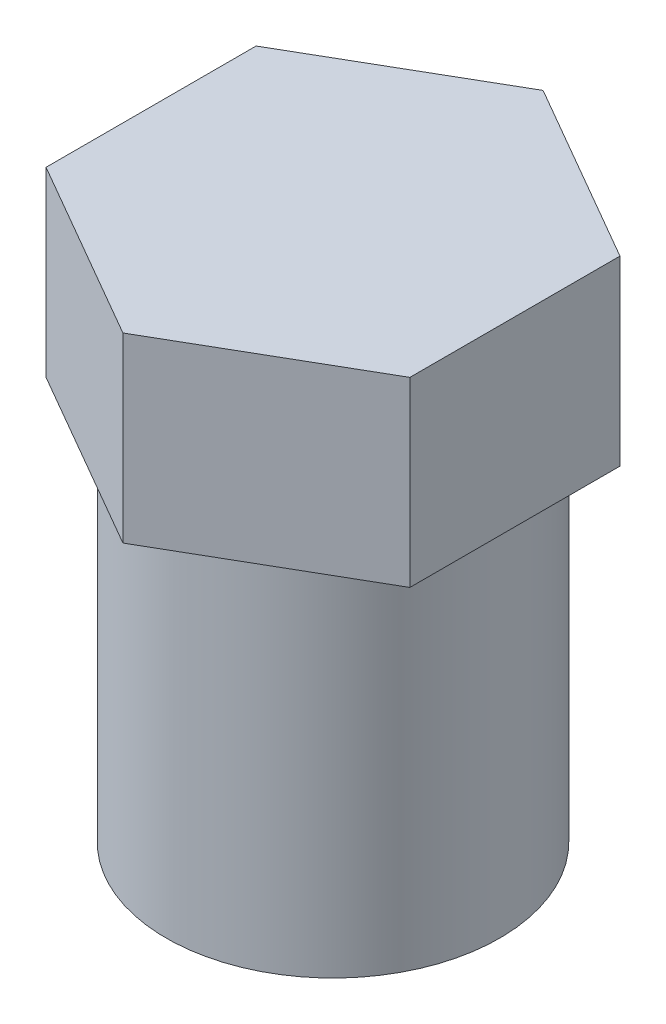
ISO-10303-21;
HEADER;
FILE_DESCRIPTION(('STEP AP214'),'2;1');
FILE_NAME('part.step','',(''),(''),'','','');
FILE_SCHEMA(('AUTOMOTIVE_DESIGN { 1 0 10303 214 1 1 1 1 }'));
ENDSEC;
DATA;
#1=APPLICATION_CONTEXT('core data for automotive mechanical design processes');
#2=APPLICATION_PROTOCOL_DEFINITION('international standard','automotive_design',2000,#1);
#3=PRODUCT_CONTEXT('',#1,'mechanical');
#4=PRODUCT('Part','Part','',(#3));
#5=PRODUCT_RELATED_PRODUCT_CATEGORY('part','',(#4));
#6=PRODUCT_DEFINITION_FORMATION('','',#4);
#7=PRODUCT_DEFINITION_CONTEXT('part definition',#1,'design');
#8=PRODUCT_DEFINITION('design','',#6,#7);
#9=PRODUCT_DEFINITION_SHAPE('','',#8);
#10=(LENGTH_UNIT() NAMED_UNIT(*) SI_UNIT(.MILLI.,.METRE.));
#11=(NAMED_UNIT(*) PLANE_ANGLE_UNIT() SI_UNIT($,.RADIAN.));
#12=(NAMED_UNIT(*) SI_UNIT($,.STERADIAN.) SOLID_ANGLE_UNIT());
#13=UNCERTAINTY_MEASURE_WITH_UNIT(LENGTH_MEASURE(1.E-05),#10,'distance_accuracy_value','');
#14=(GEOMETRIC_REPRESENTATION_CONTEXT(3) GLOBAL_UNCERTAINTY_ASSIGNED_CONTEXT((#13)) GLOBAL_UNIT_ASSIGNED_CONTEXT((#10,
#11,#12)) REPRESENTATION_CONTEXT('',''));
#15=CARTESIAN_POINT('',(0.,0.,0.));
#16=DIRECTION('',(0.,0.,1.));
#17=DIRECTION('',(1.,0.,0.));
#18=AXIS2_PLACEMENT_3D('',#15,#16,#17);
#19=CARTESIAN_POINT('',(5.99999999999996,6.,-3.46410161513783));
#20=DIRECTION('',(-0.499999999999995,0.,0.866025403784441));
#21=DIRECTION('',(0.866025403784441,0.,0.499999999999995));
#22=AXIS2_PLACEMENT_3D('',#19,#20,#21);
#23=PLANE('',#22);
#24=DIRECTION('',(-0.866025403784441,0.,-0.499999999999995));
#25=VECTOR('',#24,1.);
#26=CARTESIAN_POINT('',(5.99999999999996,0.,-3.46410161513783));
#27=LINE('',#26,#25);
#28=CARTESIAN_POINT('',(5.99999999999996,0.,-3.46410161513783));
#29=VERTEX_POINT('',#28);
#30=CARTESIAN_POINT('',(0.,0.,-6.92820323027551));
#31=VERTEX_POINT('',#30);
#32=EDGE_CURVE('E127',#29,#31,#27,.T.);
#33=ORIENTED_EDGE('',*,*,#32,.T.);
#34=DIRECTION('',(0.,-1.,0.));
#35=VECTOR('',#34,1.);
#36=CARTESIAN_POINT('',(0.,6.,-6.92820323027551));
#37=LINE('',#36,#35);
#38=CARTESIAN_POINT('',(0.,6.,-6.92820323027551));
#39=VERTEX_POINT('',#38);
#40=EDGE_CURVE('E49',#39,#31,#37,.T.);
#41=ORIENTED_EDGE('',*,*,#40,.F.);
#42=DIRECTION('',(-0.866025403784441,0.,-0.499999999999995));
#43=VECTOR('',#42,1.);
#44=CARTESIAN_POINT('',(5.99999999999996,6.,-3.46410161513783));
#45=LINE('',#44,#43);
#46=CARTESIAN_POINT('',(5.99999999999996,6.,-3.46410161513783));
#47=VERTEX_POINT('',#46);
#48=EDGE_CURVE('E138',#47,#39,#45,.T.);
#49=ORIENTED_EDGE('',*,*,#48,.F.);
#50=DIRECTION('',(0.,-1.,0.));
#51=VECTOR('',#50,1.);
#52=CARTESIAN_POINT('',(5.99999999999996,6.,-3.46410161513783));
#53=LINE('',#52,#51);
#54=EDGE_CURVE('E123',#47,#29,#53,.T.);
#55=ORIENTED_EDGE('',*,*,#54,.T.);
#56=EDGE_LOOP('',(#33,#41,#49,#55));
#57=FACE_BOUND('',#56,.T.);
#58=ADVANCED_FACE('F35',(#57),#23,.F.);
#59=CARTESIAN_POINT('',(0.,6.,-6.92820323027551));
#60=DIRECTION('',(0.500000000000001,0.,0.866025403784438));
#61=DIRECTION('',(0.866025403784438,0.,-0.500000000000001));
#62=AXIS2_PLACEMENT_3D('',#59,#60,#61);
#63=PLANE('',#62);
#64=DIRECTION('',(-0.866025403784438,0.,0.500000000000001));
#65=VECTOR('',#64,1.);
#66=CARTESIAN_POINT('',(0.,0.,-6.92820323027551));
#67=LINE('',#66,#65);
#68=CARTESIAN_POINT('',(-6.00000000000001,0.,-3.46410161513774));
#69=VERTEX_POINT('',#68);
#70=EDGE_CURVE('E130',#31,#69,#67,.T.);
#71=ORIENTED_EDGE('',*,*,#70,.T.);
#72=DIRECTION('',(0.,-1.,0.));
#73=VECTOR('',#72,1.);
#74=CARTESIAN_POINT('',(-6.00000000000001,6.,-3.46410161513774));
#75=LINE('',#74,#73);
#76=CARTESIAN_POINT('',(-6.00000000000001,6.,-3.46410161513774));
#77=VERTEX_POINT('',#76);
#78=EDGE_CURVE('E142',#77,#69,#75,.T.);
#79=ORIENTED_EDGE('',*,*,#78,.F.);
#80=DIRECTION('',(-0.866025403784438,0.,0.500000000000001));
#81=VECTOR('',#80,1.);
#82=CARTESIAN_POINT('',(0.,6.,-6.92820323027551));
#83=LINE('',#82,#81);
#84=EDGE_CURVE('E96',#39,#77,#83,.T.);
#85=ORIENTED_EDGE('',*,*,#84,.F.);
#86=ORIENTED_EDGE('',*,*,#40,.T.);
#87=EDGE_LOOP('',(#71,#79,#85,#86));
#88=FACE_BOUND('',#87,.T.);
#89=ADVANCED_FACE('F174',(#88),#63,.F.);
#90=CARTESIAN_POINT('',(-6.00000000000001,6.,-3.46410161513774));
#91=DIRECTION('',(1.,0.,0.));
#92=DIRECTION('',(0.,0.,-1.));
#93=AXIS2_PLACEMENT_3D('',#90,#91,#92);
#94=PLANE('',#93);
#95=DIRECTION('',(0.,0.,1.));
#96=VECTOR('',#95,1.);
#97=CARTESIAN_POINT('',(-6.00000000000001,0.,-3.46410161513774));
#98=LINE('',#97,#96);
#99=CARTESIAN_POINT('',(-5.99999999999999,0.,3.46410161513778));
#100=VERTEX_POINT('',#99);
#101=EDGE_CURVE('E133',#69,#100,#98,.T.);
#102=ORIENTED_EDGE('',*,*,#101,.T.);
#103=DIRECTION('',(0.,-1.,0.));
#104=VECTOR('',#103,1.);
#105=CARTESIAN_POINT('',(-5.99999999999999,6.,3.46410161513778));
#106=LINE('',#105,#104);
#107=CARTESIAN_POINT('',(-5.99999999999999,6.,3.46410161513778));
#108=VERTEX_POINT('',#107);
#109=EDGE_CURVE('E118',#108,#100,#106,.T.);
#110=ORIENTED_EDGE('',*,*,#109,.F.);
#111=DIRECTION('',(0.,0.,1.));
#112=VECTOR('',#111,1.);
#113=CARTESIAN_POINT('',(-6.00000000000001,6.,-3.46410161513774));
#114=LINE('',#113,#112);
#115=EDGE_CURVE('E109',#77,#108,#114,.T.);
#116=ORIENTED_EDGE('',*,*,#115,.F.);
#117=ORIENTED_EDGE('',*,*,#78,.T.);
#118=EDGE_LOOP('',(#102,#110,#116,#117));
#119=FACE_BOUND('',#118,.T.);
#120=ADVANCED_FACE('F179',(#119),#94,.F.);
#121=CARTESIAN_POINT('',(-5.99999999999999,6.,3.46410161513778));
#122=DIRECTION('',(0.499999999999995,0.,-0.866025403784441));
#123=DIRECTION('',(-0.866025403784442,0.,-0.499999999999995));
#124=AXIS2_PLACEMENT_3D('',#121,#122,#123);
#125=PLANE('',#124);
#126=DIRECTION('',(0.866025403784442,0.,0.499999999999995));
#127=VECTOR('',#126,1.);
#128=CARTESIAN_POINT('',(-5.99999999999999,0.,3.46410161513778));
#129=LINE('',#128,#127);
#130=CARTESIAN_POINT('',(0.,0.,6.92820323027551));
#131=VERTEX_POINT('',#130);
#132=EDGE_CURVE('E117',#100,#131,#129,.T.);
#133=ORIENTED_EDGE('',*,*,#132,.T.);
#134=DIRECTION('',(0.,-1.,0.));
#135=VECTOR('',#134,1.);
#136=CARTESIAN_POINT('',(0.,6.,6.92820323027551));
#137=LINE('',#136,#135);
#138=CARTESIAN_POINT('',(0.,6.,6.92820323027551));
#139=VERTEX_POINT('',#138);
#140=EDGE_CURVE('E114',#139,#131,#137,.T.);
#141=ORIENTED_EDGE('',*,*,#140,.F.);
#142=DIRECTION('',(0.866025403784442,0.,0.499999999999995));
#143=VECTOR('',#142,1.);
#144=CARTESIAN_POINT('',(-5.99999999999999,6.,3.46410161513778));
#145=LINE('',#144,#143);
#146=EDGE_CURVE('E103',#108,#139,#145,.T.);
#147=ORIENTED_EDGE('',*,*,#146,.F.);
#148=ORIENTED_EDGE('',*,*,#109,.T.);
#149=EDGE_LOOP('',(#133,#141,#147,#148));
#150=FACE_BOUND('',#149,.T.);
#151=ADVANCED_FACE('F115',(#150),#125,.F.);
#152=CARTESIAN_POINT('',(0.,6.,6.92820323027551));
#153=DIRECTION('',(-0.500000000000007,0.,-0.866025403784435));
#154=DIRECTION('',(-0.866025403784434,0.,0.500000000000007));
#155=AXIS2_PLACEMENT_3D('',#152,#153,#154);
#156=PLANE('',#155);
#157=DIRECTION('',(0.866025403784435,0.,-0.500000000000007));
#158=VECTOR('',#157,1.);
#159=CARTESIAN_POINT('',(0.,0.,6.92820323027551));
#160=LINE('',#159,#158);
#161=CARTESIAN_POINT('',(6.00000000000004,0.,3.4641016151377));
#162=VERTEX_POINT('',#161);
#163=EDGE_CURVE('E81',#131,#162,#160,.T.);
#164=ORIENTED_EDGE('',*,*,#163,.T.);
#165=DIRECTION('',(0.,-1.,0.));
#166=VECTOR('',#165,1.);
#167=CARTESIAN_POINT('',(6.00000000000004,6.,3.4641016151377));
#168=LINE('',#167,#166);
#169=CARTESIAN_POINT('',(6.00000000000004,6.,3.4641016151377));
#170=VERTEX_POINT('',#169);
#171=EDGE_CURVE('E119',#170,#162,#168,.T.);
#172=ORIENTED_EDGE('',*,*,#171,.F.);
#173=DIRECTION('',(0.866025403784435,0.,-0.500000000000007));
#174=VECTOR('',#173,1.);
#175=CARTESIAN_POINT('',(0.,6.,6.92820323027551));
#176=LINE('',#175,#174);
#177=EDGE_CURVE('E107',#139,#170,#176,.T.);
#178=ORIENTED_EDGE('',*,*,#177,.F.);
#179=ORIENTED_EDGE('',*,*,#140,.T.);
#180=EDGE_LOOP('',(#164,#172,#178,#179));
#181=FACE_BOUND('',#180,.T.);
#182=ADVANCED_FACE('F121',(#181),#156,.F.);
#183=CARTESIAN_POINT('',(6.00000000000004,6.,3.4641016151377));
#184=DIRECTION('',(-1.,0.,0.));
#185=DIRECTION('',(0.,0.,1.));
#186=AXIS2_PLACEMENT_3D('',#183,#184,#185);
#187=PLANE('',#186);
#188=DIRECTION('',(0.,0.,-1.));
#189=VECTOR('',#188,1.);
#190=CARTESIAN_POINT('',(6.00000000000004,0.,3.4641016151377));
#191=LINE('',#190,#189);
#192=EDGE_CURVE('E87',#162,#29,#191,.T.);
#193=ORIENTED_EDGE('',*,*,#192,.T.);
#194=ORIENTED_EDGE('',*,*,#54,.F.);
#195=DIRECTION('',(0.,0.,-1.));
#196=VECTOR('',#195,1.);
#197=CARTESIAN_POINT('',(6.00000000000004,6.,3.4641016151377));
#198=LINE('',#197,#196);
#199=EDGE_CURVE('E58',#170,#47,#198,.T.);
#200=ORIENTED_EDGE('',*,*,#199,.F.);
#201=ORIENTED_EDGE('',*,*,#171,.T.);
#202=EDGE_LOOP('',(#193,#194,#200,#201));
#203=FACE_BOUND('',#202,.T.);
#204=ADVANCED_FACE('F249',(#203),#187,.F.);
#205=CARTESIAN_POINT('',(0.,6.,0.));
#206=DIRECTION('',(0.,1.,0.));
#207=DIRECTION('',(0.,0.,1.));
#208=AXIS2_PLACEMENT_3D('',#205,#206,#207);
#209=PLANE('',#208);
#210=ORIENTED_EDGE('',*,*,#48,.T.);
#211=ORIENTED_EDGE('',*,*,#84,.T.);
#212=ORIENTED_EDGE('',*,*,#115,.T.);
#213=ORIENTED_EDGE('',*,*,#146,.T.);
#214=ORIENTED_EDGE('',*,*,#177,.T.);
#215=ORIENTED_EDGE('',*,*,#199,.T.);
#216=EDGE_LOOP('',(#210,#211,#212,#213,#214,#215));
#217=FACE_BOUND('',#216,.T.);
#218=ADVANCED_FACE('F105',(#217),#209,.T.);
#219=CARTESIAN_POINT('',(0.,0.,0.));
#220=DIRECTION('',(0.,1.,0.));
#221=DIRECTION('',(0.,0.,1.));
#222=AXIS2_PLACEMENT_3D('',#219,#220,#221);
#223=PLANE('',#222);
#224=CARTESIAN_POINT('',(0.,0.,0.));
#225=DIRECTION('',(0.,-1.,0.));
#226=DIRECTION('',(0.,0.,-1.));
#227=AXIS2_PLACEMENT_3D('',#224,#225,#226);
#228=CIRCLE('',#227,5.5);
#229=CARTESIAN_POINT('',(0.,0.,-5.5));
#230=VERTEX_POINT('',#229);
#231=EDGE_CURVE('E11',#230,#230,#228,.T.);
#232=ORIENTED_EDGE('',*,*,#231,.F.);
#233=EDGE_LOOP('',(#232));
#234=FACE_BOUND('',#233,.T.);
#235=ORIENTED_EDGE('',*,*,#32,.F.);
#236=ORIENTED_EDGE('',*,*,#192,.F.);
#237=ORIENTED_EDGE('',*,*,#163,.F.);
#238=ORIENTED_EDGE('',*,*,#132,.F.);
#239=ORIENTED_EDGE('',*,*,#101,.F.);
#240=ORIENTED_EDGE('',*,*,#70,.F.);
#241=EDGE_LOOP('',(#235,#236,#237,#238,#239,#240));
#242=FACE_BOUND('',#241,.T.);
#243=ADVANCED_FACE('F169',(#234,#242),#223,.F.);
#244=CARTESIAN_POINT('',(0.,-12.,0.));
#245=DIRECTION('',(0.,1.,0.));
#246=DIRECTION('',(0.,0.,1.));
#247=AXIS2_PLACEMENT_3D('',#244,#245,#246);
#248=CYLINDRICAL_SURFACE('',#247,5.5);
#249=CARTESIAN_POINT('',(-5.1234753829798,-7.,-2.));
#250=CARTESIAN_POINT('',(-5.12347275124282,-6.89172548018113,-2.00000293004249));
#251=CARTESIAN_POINT('',(-5.12694498493579,-6.78347092628613,-1.99117807280778));
#252=CARTESIAN_POINT('',(-5.14036861337636,-6.57020985979545,-1.95626052376498));
#253=CARTESIAN_POINT('',(-5.15032013538133,-6.46520341103706,-1.93016749279877));
#254=CARTESIAN_POINT('',(-5.17542921474239,-6.26157249461719,-1.86178456784124));
#255=CARTESIAN_POINT('',(-5.19057495144291,-6.16293413529877,-1.81953142504295));
#256=CARTESIAN_POINT('',(-5.22434741198108,-5.97410911740934,-1.72015671965849));
#257=CARTESIAN_POINT('',(-5.24297511069384,-5.88392483644354,-1.6630309913018));
#258=CARTESIAN_POINT('',(-5.28258718364165,-5.71035806340131,-1.53267636473142));
#259=CARTESIAN_POINT('',(-5.30363801656239,-5.62742653938288,-1.4588670457784));
#260=CARTESIAN_POINT('',(-5.34516804915705,-5.4748035199375,-1.29847395090625));
#261=CARTESIAN_POINT('',(-5.36564713533957,-5.40511463744909,-1.21188765990613));
#262=CARTESIAN_POINT('',(-5.40451035360989,-5.27881896255055,-1.02501099836122));
#263=CARTESIAN_POINT('',(-5.42280740918454,-5.222697351952,-0.924373007095125));
#264=CARTESIAN_POINT('',(-5.45445066356555,-5.1283653820368,-0.714302322619149));
#265=CARTESIAN_POINT('',(-5.46779846913091,-5.09014920871028,-0.60487249771308));
#266=CARTESIAN_POINT('',(-5.48756783205576,-5.0342796255303,-0.385062073334404));
#267=CARTESIAN_POINT('',(-5.49424974471739,-5.01585091991153,-0.274902399081436));
#268=CARTESIAN_POINT('',(-5.50086592417043,-4.99760062701617,-0.0528649522640321));
#269=CARTESIAN_POINT('',(-5.50080225482922,-4.9977733484772,0.0590122843232879));
#270=CARTESIAN_POINT('',(-5.49410314529077,-5.01625804871551,0.275771839144134));
#271=CARTESIAN_POINT('',(-5.48777385144891,-5.03372501560086,0.380737295657428));
#272=CARTESIAN_POINT('',(-5.46965132675473,-5.08488779237092,0.58613056813452));
#273=CARTESIAN_POINT('',(-5.45785771214351,-5.11858474209281,0.686558064853939));
#274=CARTESIAN_POINT('',(-5.42977365154599,-5.20167112791483,0.881716621745934));
#275=CARTESIAN_POINT('',(-5.41342160655289,-5.25127703485836,0.976346291487417));
#276=CARTESIAN_POINT('',(-5.3778890146266,-5.36458571627674,1.15616750349392));
#277=CARTESIAN_POINT('',(-5.35870758734871,-5.42829288136978,1.24135609372563));
#278=CARTESIAN_POINT('',(-5.31825370520588,-5.57212122949376,1.40487115253366));
#279=CARTESIAN_POINT('',(-5.29692427580929,-5.65295551665437,1.48255722943363));
#280=CARTESIAN_POINT('',(-5.25543998031253,-5.82664939750349,1.62350275267861));
#281=CARTESIAN_POINT('',(-5.23528537474477,-5.9195116439473,1.68675900801674));
#282=CARTESIAN_POINT('',(-5.19808646871716,-6.1170090875138,1.79817338979411));
#283=CARTESIAN_POINT('',(-5.18111156119855,-6.22184079164852,1.84600819097445));
#284=CARTESIAN_POINT('',(-5.15299456396793,-6.43884989246763,1.9231098188622));
#285=CARTESIAN_POINT('',(-5.14184946095981,-6.55102346050333,1.95238623964435));
#286=CARTESIAN_POINT('',(-5.1273564341492,-6.77323584920283,1.99012706465182));
#287=CARTESIAN_POINT('',(-5.12363032042963,-6.88307821022063,1.99960222005341));
#288=CARTESIAN_POINT('',(-5.12333014498252,-7.10282270479224,2.0003729322056));
#289=CARTESIAN_POINT('',(-5.12675444502666,-7.21272481888859,1.99167265312223));
#290=CARTESIAN_POINT('',(-5.13998707932388,-7.42445758088148,1.95725385007431));
#291=CARTESIAN_POINT('',(-5.14951074215574,-7.5264312662632,1.932293376511));
#292=CARTESIAN_POINT('',(-5.17353825947002,-7.72470449059177,1.86700383745764));
#293=CARTESIAN_POINT('',(-5.18804309688305,-7.8210029052452,1.8266717385262));
#294=CARTESIAN_POINT('',(-5.22104178436916,-8.00904072106525,1.73014628242229));
#295=CARTESIAN_POINT('',(-5.23966036509127,-8.1004914897095,1.67343452272378));
#296=CARTESIAN_POINT('',(-5.2785702148295,-8.27293947454524,1.54632097468222));
#297=CARTESIAN_POINT('',(-5.29886206232384,-8.35393305045907,1.4759144402832));
#298=CARTESIAN_POINT('',(-5.34027831804469,-8.50811639002829,1.3184928745526));
#299=CARTESIAN_POINT('',(-5.36138127331166,-8.58056447815956,1.23074335617831));
#300=CARTESIAN_POINT('',(-5.40088600164408,-8.70978457585342,1.0438122274277));
#301=CARTESIAN_POINT('',(-5.41928780194537,-8.76655674348198,0.944630732338449));
#302=CARTESIAN_POINT('',(-5.45127914439048,-8.86238603848029,0.737859865857853));
#303=CARTESIAN_POINT('',(-5.46489033553503,-8.90152309083302,0.630311072702586));
#304=CARTESIAN_POINT('',(-5.48584856400872,-8.96094793609874,0.409553138551503));
#305=CARTESIAN_POINT('',(-5.49319834804629,-8.98124399439246,0.296346502593666));
#306=CARTESIAN_POINT('',(-5.50056012970964,-9.00155982883129,0.0742113093359567));
#307=CARTESIAN_POINT('',(-5.50095445015368,-9.00263610668352,-0.0346088654444554));
#308=CARTESIAN_POINT('',(-5.49534201670205,-8.98716789685619,-0.250810149350172));
#309=CARTESIAN_POINT('',(-5.48933595867302,-8.97062532474625,-0.358191413632605));
#310=CARTESIAN_POINT('',(-5.47176319875057,-8.92112175467744,-0.566097461624113));
#311=CARTESIAN_POINT('',(-5.46032074736635,-8.88852705274896,-0.666720749684608));
#312=CARTESIAN_POINT('',(-5.43306256066775,-8.80820121601172,-0.861088174637646));
#313=CARTESIAN_POINT('',(-5.41724600166191,-8.76046723006428,-0.954831011655941));
#314=CARTESIAN_POINT('',(-5.38203268701368,-8.64899376545484,-1.13696105031524));
#315=CARTESIAN_POINT('',(-5.36251616875207,-8.58468061958829,-1.2249735833326));
#316=CARTESIAN_POINT('',(-5.32231551394997,-8.4427982133627,-1.38928958654361));
#317=CARTESIAN_POINT('',(-5.3016309732524,-8.36522434549552,-1.46558896939242));
#318=CARTESIAN_POINT('',(-5.26019720838331,-8.19450784404667,-1.60813820448701));
#319=CARTESIAN_POINT('',(-5.23949422132872,-8.1007896417904,-1.67371473191059));
#320=CARTESIAN_POINT('',(-5.20154028091866,-7.90300712368778,-1.78819204365536));
#321=CARTESIAN_POINT('',(-5.18428929988923,-7.7989428907932,-1.83709296166334));
#322=CARTESIAN_POINT('',(-5.15519540848633,-7.58125521253761,-1.91724549557285));
#323=CARTESIAN_POINT('',(-5.14345722978478,-7.46749169623036,-1.94815779531079));
#324=CARTESIAN_POINT('',(-5.12760076343699,-7.23580933483842,-1.98952777846176));
#325=CARTESIAN_POINT('',(-5.12347824850094,-7.11789283205346,-1.99999680967408));
#326=CARTESIAN_POINT('',(-5.1234753829798,-7.,-2.));
#327=B_SPLINE_CURVE_WITH_KNOTS('',3,(#249,#250,#251,#252,#253,#254,#255,#256,#257,#258,#259,
#260,#261,#262,#263,#264,#265,#266,#267,#268,#269,#270,#271,#272,#273,#274,#275,#276,#277,#278,
#279,#280,#281,#282,#283,#284,#285,#286,#287,#288,#289,#290,#291,#292,#293,#294,#295,#296,#297,
#298,#299,#300,#301,#302,#303,#304,#305,#306,#307,#308,#309,#310,#311,#312,#313,#314,#315,#316,
#317,#318,#319,#320,#321,#322,#323,#324,#325,#326),.UNSPECIFIED.,.T.,.F.,(4,2,2,2,2,2,2,2,2,2,2,
2,2,2,2,2,2,2,2,2,2,2,2,2,2,2,2,2,2,2,2,2,2,2,2,2,2,2,4),(0.,0.324385235377267,
0.648776842079718,0.972435065073583,1.29618404156546,1.63366988764055,1.97122225489985,
2.31948370902438,2.66763200192577,3.00157681867777,3.33541946250727,3.65371703874088,
3.97203697238109,4.29488638598021,4.61783646488796,4.95865365420964,5.29954613884792,
5.64718022486076,5.99463444855926,6.32387056541214,6.6530312593916,6.96784950829476,
7.28272991572498,7.60893794143316,7.93525921974557,8.28082051863007,8.62637833296748,
8.97035387486194,9.31417844625912,9.63904117518342,9.96386858774744,10.2816050472769,
10.5994013807848,10.9301665077848,11.26104679535,11.6080968285023,11.9551440793218,
12.3085415361896,12.6617427707823),.UNSPECIFIED.);
#328=CARTESIAN_POINT('',(-5.1234753829798,-7.,-2.));
#329=VERTEX_POINT('',#328);
#330=EDGE_CURVE('E145',#329,#329,#327,.T.);
#331=ORIENTED_EDGE('',*,*,#330,.T.);
#332=EDGE_LOOP('',(#331));
#333=FACE_BOUND('',#332,.T.);
#334=CARTESIAN_POINT('',(0.,-12.,0.));
#335=DIRECTION('',(0.,-1.,0.));
#336=DIRECTION('',(0.,0.,-1.));
#337=AXIS2_PLACEMENT_3D('',#334,#335,#336);
#338=CIRCLE('',#337,5.5);
#339=CARTESIAN_POINT('',(0.,-12.,-5.5));
#340=VERTEX_POINT('',#339);
#341=EDGE_CURVE('E131',#340,#340,#338,.T.);
#342=ORIENTED_EDGE('',*,*,#341,.F.);
#343=EDGE_LOOP('',(#342));
#344=FACE_BOUND('',#343,.T.);
#345=ORIENTED_EDGE('',*,*,#231,.T.);
#346=EDGE_LOOP('',(#345));
#347=FACE_BOUND('',#346,.T.);
#348=ADVANCED_FACE('F151',(#333,#344,#347),#248,.T.);
#349=CARTESIAN_POINT('',(0.,-12.,0.));
#350=DIRECTION('',(0.,-1.,0.));
#351=DIRECTION('',(0.,0.,-1.));
#352=AXIS2_PLACEMENT_3D('',#349,#350,#351);
#353=PLANE('',#352);
#354=CARTESIAN_POINT('',(0.,-12.,0.));
#355=DIRECTION('',(0.,-1.,0.));
#356=DIRECTION('',(0.,0.,-1.));
#357=AXIS2_PLACEMENT_3D('',#354,#355,#356);
#358=CIRCLE('',#357,3.);
#359=CARTESIAN_POINT('',(0.,-12.,-3.));
#360=VERTEX_POINT('',#359);
#361=EDGE_CURVE('E191',#360,#360,#358,.T.);
#362=ORIENTED_EDGE('',*,*,#361,.F.);
#363=EDGE_LOOP('',(#362));
#364=FACE_BOUND('',#363,.T.);
#365=ORIENTED_EDGE('',*,*,#341,.T.);
#366=EDGE_LOOP('',(#365));
#367=FACE_BOUND('',#366,.T.);
#368=ADVANCED_FACE('F159',(#364,#367),#353,.T.);
#369=CARTESIAN_POINT('',(-12.,-7.,0.));
#370=DIRECTION('',(1.,0.,0.));
#371=DIRECTION('',(0.,0.,-1.));
#372=AXIS2_PLACEMENT_3D('',#369,#370,#371);
#373=CYLINDRICAL_SURFACE('',#372,2.);
#374=CARTESIAN_POINT('',(-2.23606797749979,-7.,-2.));
#375=CARTESIAN_POINT('',(-2.23607753462817,-6.90237168913138,-1.99999453997731));
#376=CARTESIAN_POINT('',(-2.24258071047442,-6.8047092462912,-1.99278992503664));
#377=CARTESIAN_POINT('',(-2.26731972501617,-6.61288008834919,-1.96458268317731));
#378=CARTESIAN_POINT('',(-2.2855766081271,-6.51871996447043,-1.94355530587862));
#379=CARTESIAN_POINT('',(-2.3305658582557,-6.33726455812232,-1.88935861676632));
#380=CARTESIAN_POINT('',(-2.35721561794601,-6.24991230326234,-1.85630718014214));
#381=CARTESIAN_POINT('',(-2.41584094681825,-6.08213416765334,-1.77934008393538));
#382=CARTESIAN_POINT('',(-2.44781762158831,-6.00170973002353,-1.73542216812163));
#383=CARTESIAN_POINT('',(-2.51946072932026,-5.83635311238309,-1.63002410007714));
#384=CARTESIAN_POINT('',(-2.55954936090364,-5.7526678822828,-1.56687435451732));
#385=CARTESIAN_POINT('',(-2.63944827308083,-5.59599729112572,-1.4281921974068));
#386=CARTESIAN_POINT('',(-2.67925824297985,-5.52302247834147,-1.3526477317708));
#387=CARTESIAN_POINT('',(-2.76088818523747,-5.37935634121834,-1.17815690494296));
#388=CARTESIAN_POINT('',(-2.80216785846923,-5.31051748822433,-1.07740643965819));
#389=CARTESIAN_POINT('',(-2.87558484482764,-5.19135790450993,-0.862470964212232));
#390=CARTESIAN_POINT('',(-2.90773236231037,-5.14101648596881,-0.748301152321703));
#391=CARTESIAN_POINT('',(-2.95599907464725,-5.06644359898255,-0.523249073480003));
#392=CARTESIAN_POINT('',(-2.97351175615867,-5.03991665550444,-0.413434725181416));
#393=CARTESIAN_POINT('',(-2.99609745461921,-5.00581551071635,-0.189695448729862));
#394=CARTESIAN_POINT('',(-3.00118613762359,-4.99821744077456,-0.0757758812858247));
#395=CARTESIAN_POINT('',(-2.99855361722953,-5.00217244994905,0.13414705023233));
#396=CARTESIAN_POINT('',(-2.99266264910127,-5.01098905131706,0.230240638008753));
#397=CARTESIAN_POINT('',(-2.9720818279002,-5.04209105135891,0.419238633271016));
#398=CARTESIAN_POINT('',(-2.95739133313102,-5.06437743230354,0.512142807649724));
#399=CARTESIAN_POINT('',(-2.92052091703736,-5.12119568479458,0.692077937671169));
#400=CARTESIAN_POINT('',(-2.89837077982679,-5.15567888519856,0.779130623845962));
#401=CARTESIAN_POINT('',(-2.84821104476287,-5.23555364295282,0.946209150653556));
#402=CARTESIAN_POINT('',(-2.82020037745161,-5.28094719150151,1.0262337049694));
#403=CARTESIAN_POINT('',(-2.75618058450702,-5.38797873745989,1.18828429196344));
#404=CARTESIAN_POINT('',(-2.71960408792025,-5.45096752335279,1.26919148099708));
#405=CARTESIAN_POINT('',(-2.64400601826998,-5.58789867948032,1.41998807498305));
#406=CARTESIAN_POINT('',(-2.60498072815232,-5.66185794593381,1.48986013519457));
#407=CARTESIAN_POINT('',(-2.52150044944152,-5.83196321021329,1.62772235326165));
#408=CARTESIAN_POINT('',(-2.47714320008932,-5.92977107971449,1.69373593126354));
#409=CARTESIAN_POINT('',(-2.39475610831095,-6.13750983922071,1.80834874945482));
#410=CARTESIAN_POINT('',(-2.3567157153489,-6.2474199944139,1.85697718654898));
#411=CARTESIAN_POINT('',(-2.30262870306889,-6.4447190620731,1.92332724567776));
#412=CARTESIAN_POINT('',(-2.28340364577668,-6.52959337005688,1.94590791747533));
#413=CARTESIAN_POINT('',(-2.25409039789612,-6.70303948981684,1.97979555580014));
#414=CARTESIAN_POINT('',(-2.24398636782354,-6.79160461117262,1.99112206964395));
#415=CARTESIAN_POINT('',(-2.23447556987372,-6.97044298644149,2.00179400148877));
#416=CARTESIAN_POINT('',(-2.2351153386647,-7.06072197852012,2.00108729753098));
#417=CARTESIAN_POINT('',(-2.24709880368953,-7.23968383395504,1.98761629716365));
#418=CARTESIAN_POINT('',(-2.25845117648851,-7.32836534410739,1.97484222690381));
#419=CARTESIAN_POINT('',(-2.28927977500747,-7.49738941754984,1.93899811187046));
#420=CARTESIAN_POINT('',(-2.30833187069749,-7.57792770900258,1.91646174529973));
#421=CARTESIAN_POINT('',(-2.3522995853365,-7.7341262360503,1.86223041628513));
#422=CARTESIAN_POINT('',(-2.3772171729463,-7.80978482296301,1.83053237805351));
#423=CARTESIAN_POINT('',(-2.43611483596194,-7.97020200384752,1.75163346599563));
#424=CARTESIAN_POINT('',(-2.47091081434316,-8.05375681154269,1.70260028818246));
#425=CARTESIAN_POINT('',(-2.54262514806634,-8.21241680261729,1.59352731501438));
#426=CARTESIAN_POINT('',(-2.57954604947543,-8.28751151674245,1.53347411883827));
#427=CARTESIAN_POINT('',(-2.66075678321007,-8.44396234746754,1.38876657712435));
#428=CARTESIAN_POINT('',(-2.70489452138573,-8.52310284824832,1.30160386514207));
#429=CARTESIAN_POINT('',(-2.78775581841638,-8.66581668294029,1.11309948866219));
#430=CARTESIAN_POINT('',(-2.82648414789457,-8.72940377125673,1.011770477457));
#431=CARTESIAN_POINT('',(-2.88790821242222,-8.82789173891759,0.817487474821798));
#432=CARTESIAN_POINT('',(-2.91225458111008,-8.86595650444037,0.726662364886322));
#433=CARTESIAN_POINT('',(-2.95278707867041,-8.92860719432044,0.538757079020516));
#434=CARTESIAN_POINT('',(-2.96898009871993,-8.95320450285977,0.44168226385877));
#435=CARTESIAN_POINT('',(-2.99178364026746,-8.98769696383876,0.243369392303444));
#436=CARTESIAN_POINT('',(-2.99835150856533,-8.99752667950668,0.142114836924319));
#437=CARTESIAN_POINT('',(-3.00109821029056,-9.00164785141711,-0.0608555465807311));
#438=CARTESIAN_POINT('',(-2.99727800938902,-8.99594075195618,-0.162571330953447));
#439=CARTESIAN_POINT('',(-2.98029555977324,-8.9703405109953,-0.355757532528106));
#440=CARTESIAN_POINT('',(-2.96783277209856,-8.95150901513819,-0.447435143070531));
#441=CARTESIAN_POINT('',(-2.93536106206933,-8.9017619905691,-0.626018422997063));
#442=CARTESIAN_POINT('',(-2.91535096747103,-8.87084458465274,-0.71292334868689));
#443=CARTESIAN_POINT('',(-2.86791765486194,-8.79606129511597,-0.885147296608351));
#444=CARTESIAN_POINT('',(-2.84013248946338,-8.75154969250492,-0.970083589200264));
#445=CARTESIAN_POINT('',(-2.77975408235472,-8.65184935537402,-1.13155266268318));
#446=CARTESIAN_POINT('',(-2.74715796645263,-8.596654232048,-1.20808037205002));
#447=CARTESIAN_POINT('',(-2.67392931472394,-8.46737109766369,-1.36329422201402));
#448=CARTESIAN_POINT('',(-2.6328391387737,-8.39167697632596,-1.44042679526091));
#449=CARTESIAN_POINT('',(-2.55053357649486,-8.22888645845416,-1.58160022281596));
#450=CARTESIAN_POINT('',(-2.50931811970155,-8.14178161116591,-1.64563128323923));
#451=CARTESIAN_POINT('',(-2.43384213590298,-7.96413240924471,-1.75513253518411));
#452=CARTESIAN_POINT('',(-2.39929086741904,-7.87435819004966,-1.8016464689721));
#453=CARTESIAN_POINT('',(-2.33747501591023,-7.68671555100684,-1.88115802340272));
#454=CARTESIAN_POINT('',(-2.31019631295305,-7.58886330613785,-1.91418190281333));
#455=CARTESIAN_POINT('',(-2.2719105192954,-7.40922853157545,-1.95936262470908));
#456=CARTESIAN_POINT('',(-2.25863695410151,-7.3286917632097,-1.97452228373248));
#457=CARTESIAN_POINT('',(-2.24071519216009,-7.16544359949546,-1.99483915818926));
#458=CARTESIAN_POINT('',(-2.23605987841475,-7.08273405573942,-2.00000462703715));
#459=CARTESIAN_POINT('',(-2.23606797749979,-7.,-2.));
#460=B_SPLINE_CURVE_WITH_KNOTS('',3,(#374,#375,#376,#377,#378,#379,#380,#381,#382,#383,#384,
#385,#386,#387,#388,#389,#390,#391,#392,#393,#394,#395,#396,#397,#398,#399,#400,#401,#402,#403,
#404,#405,#406,#407,#408,#409,#410,#411,#412,#413,#414,#415,#416,#417,#418,#419,#420,#421,#422,
#423,#424,#425,#426,#427,#428,#429,#430,#431,#432,#433,#434,#435,#436,#437,#438,#439,#440,#441,
#442,#443,#444,#445,#446,#447,#448,#449,#450,#451,#452,#453,#454,#455,#456,#457,#458,#459),
.UNSPECIFIED.,.T.,.F.,(4,2,2,2,2,2,2,2,2,2,2,2,2,2,2,2,2,2,2,2,2,2,2,2,2,2,2,2,2,2,2,2,2,2,2,2,
2,2,2,2,2,2,4),(0.,0.292506930722153,0.585539042259288,0.875772651216273,1.16606657266549,
1.50154677068637,1.83735518436275,2.22167031006289,2.6055542938858,2.94637482063579,
3.28676536688298,3.57539534955742,3.86404638283746,4.15155831973191,4.43912276903,
4.76447525946635,5.09033414796638,5.46678703504944,5.84260469743948,6.11126090401324,
6.37944966235486,6.64880037638036,6.91836943570597,7.17476451706936,7.43124577644957,
7.73899230052351,8.04711556801509,8.42254684520963,8.7976449057258,9.10070580611698,
9.40351012888472,9.70765229266164,10.0117661844615,10.2937678224973,10.5758132789284,
10.874178629859,11.1727229593109,11.5182220628451,11.863978504186,12.1833412579672,
12.5020793664923,12.7501661630426,12.9980479966543),.UNSPECIFIED.);
#461=CARTESIAN_POINT('',(-2.23606797749979,-7.,-2.));
#462=VERTEX_POINT('',#461);
#463=EDGE_CURVE('E38',#462,#462,#460,.T.);
#464=ORIENTED_EDGE('',*,*,#463,.T.);
#465=EDGE_LOOP('',(#464));
#466=FACE_BOUND('',#465,.T.);
#467=ORIENTED_EDGE('',*,*,#330,.F.);
#468=EDGE_LOOP('',(#467));
#469=FACE_BOUND('',#468,.T.);
#470=ADVANCED_FACE('F155',(#466,#469),#373,.F.);
#471=CARTESIAN_POINT('',(0.,0.,0.));
#472=DIRECTION('',(0.,-1.,0.));
#473=DIRECTION('',(0.,0.,-1.));
#474=AXIS2_PLACEMENT_3D('',#471,#472,#473);
#475=CYLINDRICAL_SURFACE('',#474,3.);
#476=ORIENTED_EDGE('',*,*,#361,.T.);
#477=EDGE_LOOP('',(#476));
#478=FACE_BOUND('',#477,.T.);
#479=CARTESIAN_POINT('',(0.,0.,0.));
#480=DIRECTION('',(0.,-1.,0.));
#481=DIRECTION('',(0.,0.,-1.));
#482=AXIS2_PLACEMENT_3D('',#479,#480,#481);
#483=CIRCLE('',#482,3.);
#484=CARTESIAN_POINT('',(0.,0.,-3.));
#485=VERTEX_POINT('',#484);
#486=EDGE_CURVE('E194',#485,#485,#483,.T.);
#487=ORIENTED_EDGE('',*,*,#486,.F.);
#488=EDGE_LOOP('',(#487));
#489=FACE_BOUND('',#488,.T.);
#490=ORIENTED_EDGE('',*,*,#463,.F.);
#491=EDGE_LOOP('',(#490));
#492=FACE_BOUND('',#491,.T.);
#493=ADVANCED_FACE('F158',(#478,#489,#492),#475,.F.);
#494=CARTESIAN_POINT('',(0.,0.,0.));
#495=DIRECTION('',(0.,-1.,0.));
#496=DIRECTION('',(0.,0.,-1.));
#497=AXIS2_PLACEMENT_3D('',#494,#495,#496);
#498=PLANE('',#497);
#499=ORIENTED_EDGE('',*,*,#486,.T.);
#500=EDGE_LOOP('',(#499));
#501=FACE_BOUND('',#500,.T.);
#502=ADVANCED_FACE('F203',(#501),#498,.T.);
#503=CLOSED_SHELL('',(#58,#89,#120,#151,#182,#204,#218,#243,#348,#368,#470,#493,#502));
#504=MANIFOLD_SOLID_BREP('B2',#503);
#505=ADVANCED_BREP_SHAPE_REPRESENTATION('',(#18,#504),#14);
#506=SHAPE_DEFINITION_REPRESENTATION(#9,#505);
ENDSEC;
END-ISO-10303-21;
